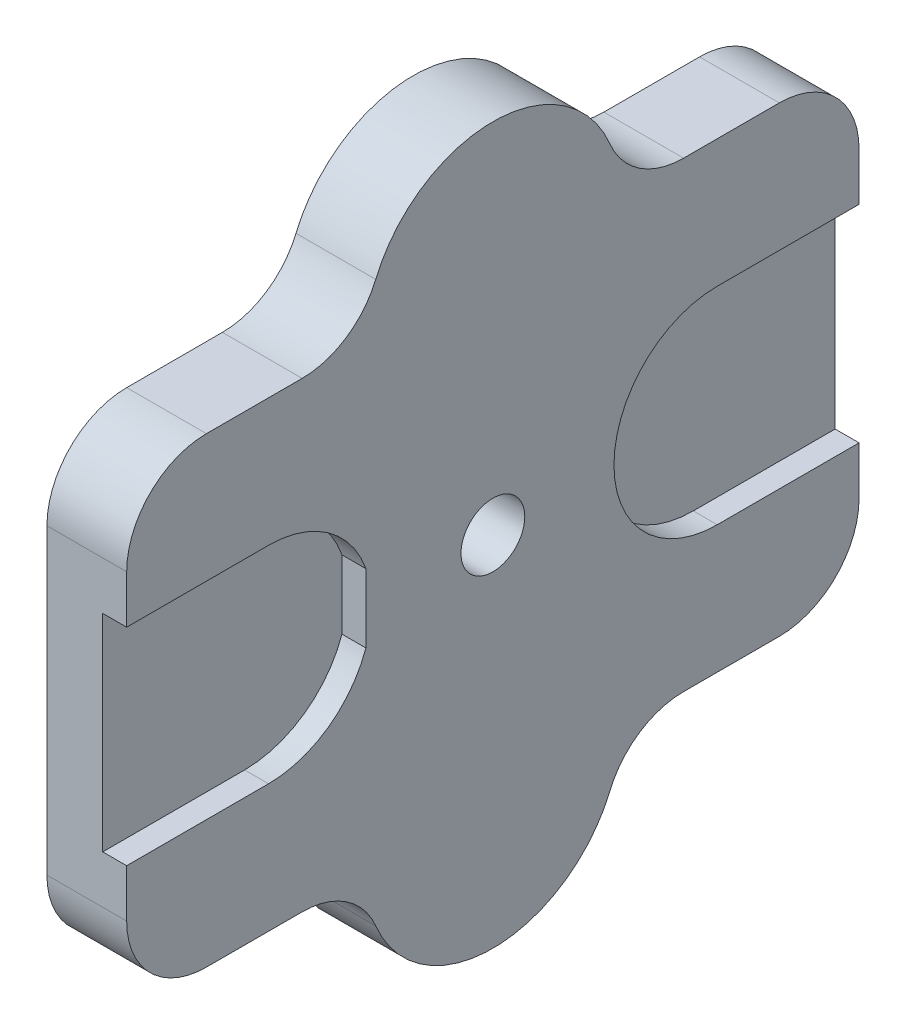
ISO-10303-21;
HEADER;
FILE_DESCRIPTION(('STEP AP214'),'2;1');
FILE_NAME('part.step','',(''),(''),'','','');
FILE_SCHEMA(('AUTOMOTIVE_DESIGN { 1 0 10303 214 1 1 1 1 }'));
ENDSEC;
DATA;
#1=APPLICATION_CONTEXT('core data for automotive mechanical design processes');
#2=APPLICATION_PROTOCOL_DEFINITION('international standard','automotive_design',2000,#1);
#3=PRODUCT_CONTEXT('',#1,'mechanical');
#4=PRODUCT('Part','Part','',(#3));
#5=PRODUCT_RELATED_PRODUCT_CATEGORY('part','',(#4));
#6=PRODUCT_DEFINITION_FORMATION('','',#4);
#7=PRODUCT_DEFINITION_CONTEXT('part definition',#1,'design');
#8=PRODUCT_DEFINITION('design','',#6,#7);
#9=PRODUCT_DEFINITION_SHAPE('','',#8);
#10=(LENGTH_UNIT() NAMED_UNIT(*) SI_UNIT(.MILLI.,.METRE.));
#11=(NAMED_UNIT(*) PLANE_ANGLE_UNIT() SI_UNIT($,.RADIAN.));
#12=(NAMED_UNIT(*) SI_UNIT($,.STERADIAN.) SOLID_ANGLE_UNIT());
#13=UNCERTAINTY_MEASURE_WITH_UNIT(LENGTH_MEASURE(1.E-05),#10,'distance_accuracy_value','');
#14=(GEOMETRIC_REPRESENTATION_CONTEXT(3) GLOBAL_UNCERTAINTY_ASSIGNED_CONTEXT((#13)) GLOBAL_UNIT_ASSIGNED_CONTEXT((#10,
#11,#12)) REPRESENTATION_CONTEXT('',''));
#15=CARTESIAN_POINT('',(0.,0.,0.));
#16=DIRECTION('',(0.,0.,1.));
#17=DIRECTION('',(1.,0.,0.));
#18=AXIS2_PLACEMENT_3D('',#15,#16,#17);
#19=CARTESIAN_POINT('',(10.,-28.9686177509747,3.13232637331732));
#20=DIRECTION('',(1.,0.,0.));
#21=DIRECTION('',(0.,0.,-1.));
#22=AXIS2_PLACEMENT_3D('',#19,#20,#21);
#23=PLANE('',#22);
#24=CARTESIAN_POINT('',(10.,0.,3.13232637331727));
#25=DIRECTION('',(-1.,0.,0.));
#26=DIRECTION('',(0.,0.,1.));
#27=AXIS2_PLACEMENT_3D('',#24,#25,#26);
#28=CIRCLE('',#27,4.);
#29=CARTESIAN_POINT('',(10.,0.,-0.867673626682733));
#30=VERTEX_POINT('',#29);
#31=EDGE_CURVE('E250',#30,#30,#28,.T.);
#32=ORIENTED_EDGE('',*,*,#31,.T.);
#33=EDGE_LOOP('',(#32));
#34=FACE_BOUND('',#33,.T.);
#35=DIRECTION('',(0.,-1.,0.));
#36=VECTOR('',#35,1.);
#37=CARTESIAN_POINT('',(10.,18.9686177509747,-42.7893341747207));
#38=LINE('',#37,#36);
#39=CARTESIAN_POINT('',(10.,-12.95,-42.7893341747207));
#40=VERTEX_POINT('',#39);
#41=CARTESIAN_POINT('',(10.,-18.9686177509747,-42.7893341747207));
#42=VERTEX_POINT('',#41);
#43=EDGE_CURVE('E265',#40,#42,#38,.T.);
#44=ORIENTED_EDGE('',*,*,#43,.F.);
#45=DIRECTION('',(0.,0.,1.));
#46=VECTOR('',#45,1.);
#47=CARTESIAN_POINT('',(10.,-12.95,-42.7893341747207));
#48=LINE('',#47,#46);
#49=CARTESIAN_POINT('',(10.,-12.95,-25.0030511371958));
#50=VERTEX_POINT('',#49);
#51=EDGE_CURVE('E240',#40,#50,#48,.T.);
#52=ORIENTED_EDGE('',*,*,#51,.T.);
#53=CARTESIAN_POINT('',(10.,0.,-25.0030511371959));
#54=DIRECTION('',(-1.,0.,0.));
#55=DIRECTION('',(0.,0.,1.));
#56=AXIS2_PLACEMENT_3D('',#53,#54,#55);
#57=CIRCLE('',#56,12.95);
#58=CARTESIAN_POINT('',(10.,12.95,-25.0030511371958));
#59=VERTEX_POINT('',#58);
#60=EDGE_CURVE('E719',#50,#59,#57,.T.);
#61=ORIENTED_EDGE('',*,*,#60,.T.);
#62=DIRECTION('',(0.,0.,-1.));
#63=VECTOR('',#62,1.);
#64=CARTESIAN_POINT('',(10.,12.95,-25.0030511371958));
#65=LINE('',#64,#63);
#66=CARTESIAN_POINT('',(10.,12.95,-42.7893341747207));
#67=VERTEX_POINT('',#66);
#68=EDGE_CURVE('E718',#59,#67,#65,.T.);
#69=ORIENTED_EDGE('',*,*,#68,.T.);
#70=CARTESIAN_POINT('',(10.,18.9686177509747,-42.7893341747207));
#71=VERTEX_POINT('',#70);
#72=EDGE_CURVE('E244',#71,#67,#38,.T.);
#73=ORIENTED_EDGE('',*,*,#72,.F.);
#74=CARTESIAN_POINT('',(10.,18.9686177509747,-32.7893341747207));
#75=DIRECTION('',(-1.,0.,0.));
#76=DIRECTION('',(0.,0.,-1.));
#77=AXIS2_PLACEMENT_3D('',#74,#75,#76);
#78=CIRCLE('',#77,10.);
#79=CARTESIAN_POINT('',(10.,28.9686177509747,-32.7893341747207));
#80=VERTEX_POINT('',#79);
#81=EDGE_CURVE('E262',#80,#71,#78,.T.);
#82=ORIENTED_EDGE('',*,*,#81,.F.);
#83=DIRECTION('',(0.,0.,-1.));
#84=VECTOR('',#83,1.);
#85=CARTESIAN_POINT('',(10.,28.9686177509747,-32.7893341747207));
#86=LINE('',#85,#84);
#87=CARTESIAN_POINT('',(10.,28.9686177509747,-20.7827836111196));
#88=VERTEX_POINT('',#87);
#89=EDGE_CURVE('E270',#88,#80,#86,.T.);
#90=ORIENTED_EDGE('',*,*,#89,.F.);
#91=CARTESIAN_POINT('',(10.,38.9686177509747,-20.7827836111196));
#92=DIRECTION('',(1.,0.,0.));
#93=DIRECTION('',(0.,0.,-1.));
#94=AXIS2_PLACEMENT_3D('',#91,#92,#93);
#95=CIRCLE('',#94,9.99999999999999);
#96=CARTESIAN_POINT('',(10.,35.1108402056403,-11.5568661819034));
#97=VERTEX_POINT('',#96);
#98=EDGE_CURVE('E269',#97,#88,#95,.T.);
#99=ORIENTED_EDGE('',*,*,#98,.F.);
#100=CARTESIAN_POINT('',(10.,28.9686177509747,3.13232637331732));
#101=DIRECTION('',(1.,0.,0.));
#102=DIRECTION('',(0.,0.,1.));
#103=AXIS2_PLACEMENT_3D('',#100,#101,#102);
#104=CIRCLE('',#103,15.921660548038);
#105=CARTESIAN_POINT('',(10.,35.1108402056403,17.821518928538));
#106=VERTEX_POINT('',#105);
#107=EDGE_CURVE('E70',#97,#106,#104,.T.);
#108=ORIENTED_EDGE('',*,*,#107,.T.);
#109=CARTESIAN_POINT('',(10.,38.9686177509747,27.0474363577541));
#110=DIRECTION('',(-1.,0.,0.));
#111=DIRECTION('',(0.,0.,1.));
#112=AXIS2_PLACEMENT_3D('',#109,#110,#111);
#113=CIRCLE('',#112,9.99999999999999);
#114=CARTESIAN_POINT('',(10.,28.9686177509747,27.0474363577541));
#115=VERTEX_POINT('',#114);
#116=EDGE_CURVE('E355',#106,#115,#113,.T.);
#117=ORIENTED_EDGE('',*,*,#116,.T.);
#118=DIRECTION('',(0.,0.,1.));
#119=VECTOR('',#118,1.);
#120=CARTESIAN_POINT('',(10.,28.9686177509747,39.0539869213552));
#121=LINE('',#120,#119);
#122=CARTESIAN_POINT('',(10.,28.9686177509747,39.0539869213552));
#123=VERTEX_POINT('',#122);
#124=EDGE_CURVE('E358',#115,#123,#121,.T.);
#125=ORIENTED_EDGE('',*,*,#124,.T.);
#126=CARTESIAN_POINT('',(10.,18.9686177509747,39.0539869213552));
#127=DIRECTION('',(1.,0.,0.));
#128=DIRECTION('',(0.,0.,1.));
#129=AXIS2_PLACEMENT_3D('',#126,#127,#128);
#130=CIRCLE('',#129,10.);
#131=CARTESIAN_POINT('',(10.,18.9686177509747,49.0539869213552));
#132=VERTEX_POINT('',#131);
#133=EDGE_CURVE('E357',#123,#132,#130,.T.);
#134=ORIENTED_EDGE('',*,*,#133,.T.);
#135=DIRECTION('',(0.,-1.,0.));
#136=VECTOR('',#135,1.);
#137=CARTESIAN_POINT('',(10.,18.9686177509747,49.0539869213552));
#138=LINE('',#137,#136);
#139=CARTESIAN_POINT('',(10.,12.95,49.0539869213552));
#140=VERTEX_POINT('',#139);
#141=EDGE_CURVE('E363',#132,#140,#138,.T.);
#142=ORIENTED_EDGE('',*,*,#141,.T.);
#143=DIRECTION('',(0.,0.,1.));
#144=VECTOR('',#143,1.);
#145=CARTESIAN_POINT('',(10.,12.95,31.2677038838304));
#146=LINE('',#145,#144);
#147=CARTESIAN_POINT('',(10.,12.95,31.2677038838304));
#148=VERTEX_POINT('',#147);
#149=EDGE_CURVE('E323',#148,#140,#146,.T.);
#150=ORIENTED_EDGE('',*,*,#149,.F.);
#151=CARTESIAN_POINT('',(10.,0.,31.2677038838304));
#152=DIRECTION('',(1.,0.,0.));
#153=DIRECTION('',(0.,0.,-1.));
#154=AXIS2_PLACEMENT_3D('',#151,#152,#153);
#155=CIRCLE('',#154,12.95);
#156=CARTESIAN_POINT('',(10.,4.30437195889774,19.0539869213552));
#157=VERTEX_POINT('',#156);
#158=EDGE_CURVE('E333',#157,#148,#155,.T.);
#159=ORIENTED_EDGE('',*,*,#158,.F.);
#160=DIRECTION('',(0.,1.,0.));
#161=VECTOR('',#160,1.);
#162=CARTESIAN_POINT('',(10.,-28.9686177509747,19.0539869213552));
#163=LINE('',#162,#161);
#164=CARTESIAN_POINT('',(10.,-4.30437195889774,19.0539869213552));
#165=VERTEX_POINT('',#164);
#166=EDGE_CURVE('E272',#165,#157,#163,.T.);
#167=ORIENTED_EDGE('',*,*,#166,.F.);
#168=CARTESIAN_POINT('',(10.,-12.95,31.2677038838304));
#169=VERTEX_POINT('',#168);
#170=EDGE_CURVE('E338',#169,#165,#155,.T.);
#171=ORIENTED_EDGE('',*,*,#170,.F.);
#172=DIRECTION('',(0.,0.,-1.));
#173=VECTOR('',#172,1.);
#174=CARTESIAN_POINT('',(10.,-12.95,49.0539869213552));
#175=LINE('',#174,#173);
#176=CARTESIAN_POINT('',(10.,-12.95,49.0539869213552));
#177=VERTEX_POINT('',#176);
#178=EDGE_CURVE('E318',#177,#169,#175,.T.);
#179=ORIENTED_EDGE('',*,*,#178,.F.);
#180=CARTESIAN_POINT('',(10.,-18.9686177509747,49.0539869213552));
#181=VERTEX_POINT('',#180);
#182=EDGE_CURVE('E356',#177,#181,#138,.T.);
#183=ORIENTED_EDGE('',*,*,#182,.T.);
#184=CARTESIAN_POINT('',(10.,-18.9686177509747,39.0539869213552));
#185=DIRECTION('',(1.,0.,0.));
#186=DIRECTION('',(0.,0.,-1.));
#187=AXIS2_PLACEMENT_3D('',#184,#185,#186);
#188=CIRCLE('',#187,10.);
#189=CARTESIAN_POINT('',(10.,-28.9686177509747,39.0539869213552));
#190=VERTEX_POINT('',#189);
#191=EDGE_CURVE('E365',#181,#190,#188,.T.);
#192=ORIENTED_EDGE('',*,*,#191,.T.);
#193=DIRECTION('',(0.,0.,-1.));
#194=VECTOR('',#193,1.);
#195=CARTESIAN_POINT('',(10.,-28.9686177509747,39.0539869213552));
#196=LINE('',#195,#194);
#197=CARTESIAN_POINT('',(10.,-28.9686177509747,27.0474363577541));
#198=VERTEX_POINT('',#197);
#199=EDGE_CURVE('E368',#190,#198,#196,.T.);
#200=ORIENTED_EDGE('',*,*,#199,.T.);
#201=CARTESIAN_POINT('',(10.,-38.9686177509747,27.0474363577541));
#202=DIRECTION('',(-1.,0.,0.));
#203=DIRECTION('',(0.,0.,-1.));
#204=AXIS2_PLACEMENT_3D('',#201,#202,#203);
#205=CIRCLE('',#204,9.99999999999999);
#206=CARTESIAN_POINT('',(10.,-35.1108402056403,17.821518928538));
#207=VERTEX_POINT('',#206);
#208=EDGE_CURVE('E366',#198,#207,#205,.T.);
#209=ORIENTED_EDGE('',*,*,#208,.T.);
#210=CARTESIAN_POINT('',(10.,-28.9686177509747,3.13232637331732));
#211=DIRECTION('',(1.,0.,0.));
#212=DIRECTION('',(0.,0.,-1.));
#213=AXIS2_PLACEMENT_3D('',#210,#211,#212);
#214=CIRCLE('',#213,15.921660548038);
#215=CARTESIAN_POINT('',(10.,-35.1108402056403,-11.5568661819034));
#216=VERTEX_POINT('',#215);
#217=EDGE_CURVE('E349',#207,#216,#214,.T.);
#218=ORIENTED_EDGE('',*,*,#217,.T.);
#219=CARTESIAN_POINT('',(10.,-38.9686177509747,-20.7827836111196));
#220=DIRECTION('',(1.,0.,0.));
#221=DIRECTION('',(0.,0.,1.));
#222=AXIS2_PLACEMENT_3D('',#219,#220,#221);
#223=CIRCLE('',#222,9.99999999999999);
#224=CARTESIAN_POINT('',(10.,-28.9686177509747,-20.7827836111196));
#225=VERTEX_POINT('',#224);
#226=EDGE_CURVE('E252',#225,#216,#223,.T.);
#227=ORIENTED_EDGE('',*,*,#226,.F.);
#228=DIRECTION('',(0.,0.,1.));
#229=VECTOR('',#228,1.);
#230=CARTESIAN_POINT('',(10.,-28.9686177509747,-32.7893341747207));
#231=LINE('',#230,#229);
#232=CARTESIAN_POINT('',(10.,-28.9686177509747,-32.7893341747207));
#233=VERTEX_POINT('',#232);
#234=EDGE_CURVE('E254',#233,#225,#231,.T.);
#235=ORIENTED_EDGE('',*,*,#234,.F.);
#236=CARTESIAN_POINT('',(10.,-18.9686177509747,-32.7893341747207));
#237=DIRECTION('',(-1.,0.,0.));
#238=DIRECTION('',(0.,0.,1.));
#239=AXIS2_PLACEMENT_3D('',#236,#237,#238);
#240=CIRCLE('',#239,10.);
#241=EDGE_CURVE('E259',#42,#233,#240,.T.);
#242=ORIENTED_EDGE('',*,*,#241,.F.);
#243=EDGE_LOOP('',(#44,#52,#61,#69,#73,#82,#90,#99,#108,#117,#125,#134,#142,#150,#159,#167,#171,
#179,#183,#192,#200,#209,#218,#227,#235,#242));
#244=FACE_BOUND('',#243,.T.);
#245=ADVANCED_FACE('F44',(#34,#244),#23,.T.);
#246=CARTESIAN_POINT('',(10.,18.9686177509747,-42.7893341747207));
#247=DIRECTION('',(0.,0.,-1.));
#248=DIRECTION('',(0.,1.,0.));
#249=AXIS2_PLACEMENT_3D('',#246,#247,#248);
#250=PLANE('',#249);
#251=DIRECTION('',(0.,-1.,0.));
#252=VECTOR('',#251,1.);
#253=CARTESIAN_POINT('',(7.,-12.95,-42.7893341747207));
#254=LINE('',#253,#252);
#255=CARTESIAN_POINT('',(7.,12.95,-42.7893341747207));
#256=VERTEX_POINT('',#255);
#257=CARTESIAN_POINT('',(7.,-12.95,-42.7893341747207));
#258=VERTEX_POINT('',#257);
#259=EDGE_CURVE('E233',#256,#258,#254,.T.);
#260=ORIENTED_EDGE('',*,*,#259,.T.);
#261=DIRECTION('',(1.,0.,0.));
#262=VECTOR('',#261,1.);
#263=CARTESIAN_POINT('',(7.,-12.95,-42.7893341747207));
#264=LINE('',#263,#262);
#265=EDGE_CURVE('E63',#258,#40,#264,.T.);
#266=ORIENTED_EDGE('',*,*,#265,.T.);
#267=ORIENTED_EDGE('',*,*,#43,.T.);
#268=DIRECTION('',(-1.,0.,0.));
#269=VECTOR('',#268,1.);
#270=CARTESIAN_POINT('',(10.,-18.9686177509747,-42.7893341747207));
#271=LINE('',#270,#269);
#272=CARTESIAN_POINT('',(0.,-18.9686177509747,-42.7893341747207));
#273=VERTEX_POINT('',#272);
#274=EDGE_CURVE('E305',#42,#273,#271,.T.);
#275=ORIENTED_EDGE('',*,*,#274,.T.);
#276=DIRECTION('',(0.,-1.,0.));
#277=VECTOR('',#276,1.);
#278=CARTESIAN_POINT('',(0.,18.9686177509747,-42.7893341747207));
#279=LINE('',#278,#277);
#280=CARTESIAN_POINT('',(0.,18.9686177509747,-42.7893341747207));
#281=VERTEX_POINT('',#280);
#282=EDGE_CURVE('E288',#281,#273,#279,.T.);
#283=ORIENTED_EDGE('',*,*,#282,.F.);
#284=DIRECTION('',(-1.,0.,0.));
#285=VECTOR('',#284,1.);
#286=CARTESIAN_POINT('',(10.,18.9686177509747,-42.7893341747207));
#287=LINE('',#286,#285);
#288=EDGE_CURVE('E304',#71,#281,#287,.T.);
#289=ORIENTED_EDGE('',*,*,#288,.F.);
#290=ORIENTED_EDGE('',*,*,#72,.T.);
#291=DIRECTION('',(1.,0.,0.));
#292=VECTOR('',#291,1.);
#293=CARTESIAN_POINT('',(7.,12.95,-42.7893341747207));
#294=LINE('',#293,#292);
#295=EDGE_CURVE('E223',#256,#67,#294,.T.);
#296=ORIENTED_EDGE('',*,*,#295,.F.);
#297=EDGE_LOOP('',(#260,#266,#267,#275,#283,#289,#290,#296));
#298=FACE_BOUND('',#297,.T.);
#299=ADVANCED_FACE('F238',(#298),#250,.T.);
#300=CARTESIAN_POINT('',(10.,-28.9686177509747,3.13232637331732));
#301=DIRECTION('',(-1.,0.,0.));
#302=DIRECTION('',(0.,0.,1.));
#303=AXIS2_PLACEMENT_3D('',#300,#301,#302);
#304=CYLINDRICAL_SURFACE('',#303,15.921660548038);
#305=DIRECTION('',(-1.,0.,0.));
#306=VECTOR('',#305,1.);
#307=CARTESIAN_POINT('',(10.,-35.1108402056403,-11.5568661819034));
#308=LINE('',#307,#306);
#309=CARTESIAN_POINT('',(0.,-35.1108402056403,-11.5568661819034));
#310=VERTEX_POINT('',#309);
#311=EDGE_CURVE('E309',#216,#310,#308,.T.);
#312=ORIENTED_EDGE('',*,*,#311,.F.);
#313=ORIENTED_EDGE('',*,*,#217,.F.);
#314=DIRECTION('',(-1.,0.,0.));
#315=VECTOR('',#314,1.);
#316=CARTESIAN_POINT('',(10.,-35.1108402056403,17.821518928538));
#317=LINE('',#316,#315);
#318=CARTESIAN_POINT('',(0.,-35.1108402056403,17.821518928538));
#319=VERTEX_POINT('',#318);
#320=EDGE_CURVE('E367',#207,#319,#317,.T.);
#321=ORIENTED_EDGE('',*,*,#320,.T.);
#322=CARTESIAN_POINT('',(0.,-28.9686177509747,3.13232637331732));
#323=DIRECTION('',(1.,0.,0.));
#324=DIRECTION('',(0.,0.,-1.));
#325=AXIS2_PLACEMENT_3D('',#322,#323,#324);
#326=CIRCLE('',#325,15.921660548038);
#327=EDGE_CURVE('E344',#319,#310,#326,.T.);
#328=ORIENTED_EDGE('',*,*,#327,.T.);
#329=EDGE_LOOP('',(#312,#313,#321,#328));
#330=FACE_BOUND('',#329,.T.);
#331=ADVANCED_FACE('F50',(#330),#304,.T.);
#332=CARTESIAN_POINT('',(7.,0.,31.2677038838304));
#333=DIRECTION('',(1.,0.,0.));
#334=DIRECTION('',(0.,0.,-1.));
#335=AXIS2_PLACEMENT_3D('',#332,#333,#334);
#336=CYLINDRICAL_SURFACE('',#335,12.95);
#337=ORIENTED_EDGE('',*,*,#170,.T.);
#338=DIRECTION('',(1.,0.,0.));
#339=VECTOR('',#338,1.);
#340=CARTESIAN_POINT('',(7.,-4.30437195889774,19.0539869213552));
#341=LINE('',#340,#339);
#342=CARTESIAN_POINT('',(7.,-4.30437195889774,19.0539869213552));
#343=VERTEX_POINT('',#342);
#344=EDGE_CURVE('E312',#165,#343,#341,.F.);
#345=ORIENTED_EDGE('',*,*,#344,.T.);
#346=CARTESIAN_POINT('',(7.,0.,31.2677038838304));
#347=DIRECTION('',(1.,0.,0.));
#348=DIRECTION('',(0.,0.,-1.));
#349=AXIS2_PLACEMENT_3D('',#346,#347,#348);
#350=CIRCLE('',#349,12.95);
#351=CARTESIAN_POINT('',(7.,-12.95,31.2677038838304));
#352=VERTEX_POINT('',#351);
#353=EDGE_CURVE('E330',#352,#343,#350,.T.);
#354=ORIENTED_EDGE('',*,*,#353,.F.);
#355=DIRECTION('',(1.,0.,0.));
#356=VECTOR('',#355,1.);
#357=CARTESIAN_POINT('',(7.,-12.95,31.2677038838304));
#358=LINE('',#357,#356);
#359=EDGE_CURVE('E347',#352,#169,#358,.T.);
#360=ORIENTED_EDGE('',*,*,#359,.T.);
#361=EDGE_LOOP('',(#337,#345,#354,#360));
#362=FACE_BOUND('',#361,.T.);
#363=ADVANCED_FACE('F439',(#362),#336,.F.);
#364=CARTESIAN_POINT('',(10.,28.9686177509747,3.13232637331732));
#365=DIRECTION('',(-1.,0.,0.));
#366=DIRECTION('',(0.,0.,1.));
#367=AXIS2_PLACEMENT_3D('',#364,#365,#366);
#368=CYLINDRICAL_SURFACE('',#367,15.921660548038);
#369=ORIENTED_EDGE('',*,*,#107,.F.);
#370=DIRECTION('',(-1.,0.,0.));
#371=VECTOR('',#370,1.);
#372=CARTESIAN_POINT('',(10.,35.1108402056403,-11.5568661819035));
#373=LINE('',#372,#371);
#374=CARTESIAN_POINT('',(0.,35.1108402056403,-11.5568661819035));
#375=VERTEX_POINT('',#374);
#376=EDGE_CURVE('E277',#97,#375,#373,.T.);
#377=ORIENTED_EDGE('',*,*,#376,.T.);
#378=CARTESIAN_POINT('',(0.,28.9686177509747,3.13232637331732));
#379=DIRECTION('',(1.,0.,0.));
#380=DIRECTION('',(0.,0.,1.));
#381=AXIS2_PLACEMENT_3D('',#378,#379,#380);
#382=CIRCLE('',#381,15.921660548038);
#383=CARTESIAN_POINT('',(0.,35.1108402056403,17.821518928538));
#384=VERTEX_POINT('',#383);
#385=EDGE_CURVE('E375',#375,#384,#382,.T.);
#386=ORIENTED_EDGE('',*,*,#385,.T.);
#387=DIRECTION('',(-1.,0.,0.));
#388=VECTOR('',#387,1.);
#389=CARTESIAN_POINT('',(10.,35.1108402056403,17.821518928538));
#390=LINE('',#389,#388);
#391=EDGE_CURVE('E53',#106,#384,#390,.T.);
#392=ORIENTED_EDGE('',*,*,#391,.F.);
#393=EDGE_LOOP('',(#369,#377,#386,#392));
#394=FACE_BOUND('',#393,.T.);
#395=ADVANCED_FACE('F437',(#394),#368,.T.);
#396=CARTESIAN_POINT('',(10.,38.9686177509747,27.0474363577541));
#397=DIRECTION('',(-1.,0.,0.));
#398=DIRECTION('',(0.,0.,1.));
#399=AXIS2_PLACEMENT_3D('',#396,#397,#398);
#400=CYLINDRICAL_SURFACE('',#399,9.99999999999999);
#401=CARTESIAN_POINT('',(0.,38.9686177509747,27.0474363577541));
#402=DIRECTION('',(-1.,0.,0.));
#403=DIRECTION('',(0.,0.,1.));
#404=AXIS2_PLACEMENT_3D('',#401,#402,#403);
#405=CIRCLE('',#404,9.99999999999999);
#406=CARTESIAN_POINT('',(0.,28.9686177509747,27.0474363577541));
#407=VERTEX_POINT('',#406);
#408=EDGE_CURVE('E372',#384,#407,#405,.T.);
#409=ORIENTED_EDGE('',*,*,#408,.T.);
#410=DIRECTION('',(-1.,0.,0.));
#411=VECTOR('',#410,1.);
#412=CARTESIAN_POINT('',(10.,28.9686177509747,27.0474363577541));
#413=LINE('',#412,#411);
#414=EDGE_CURVE('E404',#115,#407,#413,.T.);
#415=ORIENTED_EDGE('',*,*,#414,.F.);
#416=ORIENTED_EDGE('',*,*,#116,.F.);
#417=ORIENTED_EDGE('',*,*,#391,.T.);
#418=EDGE_LOOP('',(#409,#415,#416,#417));
#419=FACE_BOUND('',#418,.T.);
#420=ADVANCED_FACE('F413',(#419),#400,.F.);
#421=CARTESIAN_POINT('',(10.,28.9686177509747,39.0539869213552));
#422=DIRECTION('',(0.,-1.,0.));
#423=DIRECTION('',(0.,0.,-1.));
#424=AXIS2_PLACEMENT_3D('',#421,#422,#423);
#425=PLANE('',#424);
#426=DIRECTION('',(0.,0.,1.));
#427=VECTOR('',#426,1.);
#428=CARTESIAN_POINT('',(0.,28.9686177509747,39.0539869213552));
#429=LINE('',#428,#427);
#430=CARTESIAN_POINT('',(0.,28.9686177509747,39.0539869213552));
#431=VERTEX_POINT('',#430);
#432=EDGE_CURVE('E376',#407,#431,#429,.T.);
#433=ORIENTED_EDGE('',*,*,#432,.T.);
#434=DIRECTION('',(-1.,0.,0.));
#435=VECTOR('',#434,1.);
#436=CARTESIAN_POINT('',(10.,28.9686177509747,39.0539869213552));
#437=LINE('',#436,#435);
#438=EDGE_CURVE('E402',#123,#431,#437,.T.);
#439=ORIENTED_EDGE('',*,*,#438,.F.);
#440=ORIENTED_EDGE('',*,*,#124,.F.);
#441=ORIENTED_EDGE('',*,*,#414,.T.);
#442=EDGE_LOOP('',(#433,#439,#440,#441));
#443=FACE_BOUND('',#442,.T.);
#444=ADVANCED_FACE('F423',(#443),#425,.F.);
#445=CARTESIAN_POINT('',(10.,18.9686177509747,39.0539869213552));
#446=DIRECTION('',(-1.,0.,0.));
#447=DIRECTION('',(0.,0.,1.));
#448=AXIS2_PLACEMENT_3D('',#445,#446,#447);
#449=CYLINDRICAL_SURFACE('',#448,10.);
#450=CARTESIAN_POINT('',(0.,18.9686177509747,39.0539869213552));
#451=DIRECTION('',(1.,0.,0.));
#452=DIRECTION('',(0.,0.,1.));
#453=AXIS2_PLACEMENT_3D('',#450,#451,#452);
#454=CIRCLE('',#453,10.);
#455=CARTESIAN_POINT('',(0.,18.9686177509747,49.0539869213552));
#456=VERTEX_POINT('',#455);
#457=EDGE_CURVE('E378',#431,#456,#454,.T.);
#458=ORIENTED_EDGE('',*,*,#457,.T.);
#459=DIRECTION('',(-1.,0.,0.));
#460=VECTOR('',#459,1.);
#461=CARTESIAN_POINT('',(10.,18.9686177509747,49.0539869213552));
#462=LINE('',#461,#460);
#463=EDGE_CURVE('E397',#132,#456,#462,.T.);
#464=ORIENTED_EDGE('',*,*,#463,.F.);
#465=ORIENTED_EDGE('',*,*,#133,.F.);
#466=ORIENTED_EDGE('',*,*,#438,.T.);
#467=EDGE_LOOP('',(#458,#464,#465,#466));
#468=FACE_BOUND('',#467,.T.);
#469=ADVANCED_FACE('F422',(#468),#449,.T.);
#470=CARTESIAN_POINT('',(10.,18.9686177509747,49.0539869213552));
#471=DIRECTION('',(0.,0.,-1.));
#472=DIRECTION('',(0.,1.,0.));
#473=AXIS2_PLACEMENT_3D('',#470,#471,#472);
#474=PLANE('',#473);
#475=DIRECTION('',(0.,-1.,0.));
#476=VECTOR('',#475,1.);
#477=CARTESIAN_POINT('',(7.,-12.95,49.0539869213552));
#478=LINE('',#477,#476);
#479=CARTESIAN_POINT('',(7.,12.95,49.0539869213552));
#480=VERTEX_POINT('',#479);
#481=CARTESIAN_POINT('',(7.,-12.95,49.0539869213552));
#482=VERTEX_POINT('',#481);
#483=EDGE_CURVE('E317',#480,#482,#478,.T.);
#484=ORIENTED_EDGE('',*,*,#483,.F.);
#485=DIRECTION('',(1.,0.,0.));
#486=VECTOR('',#485,1.);
#487=CARTESIAN_POINT('',(7.,12.95,49.0539869213552));
#488=LINE('',#487,#486);
#489=EDGE_CURVE('E340',#480,#140,#488,.T.);
#490=ORIENTED_EDGE('',*,*,#489,.T.);
#491=ORIENTED_EDGE('',*,*,#141,.F.);
#492=ORIENTED_EDGE('',*,*,#463,.T.);
#493=DIRECTION('',(0.,-1.,0.));
#494=VECTOR('',#493,1.);
#495=CARTESIAN_POINT('',(0.,18.9686177509747,49.0539869213552));
#496=LINE('',#495,#494);
#497=CARTESIAN_POINT('',(0.,-18.9686177509747,49.0539869213552));
#498=VERTEX_POINT('',#497);
#499=EDGE_CURVE('E379',#456,#498,#496,.T.);
#500=ORIENTED_EDGE('',*,*,#499,.T.);
#501=DIRECTION('',(-1.,0.,0.));
#502=VECTOR('',#501,1.);
#503=CARTESIAN_POINT('',(10.,-18.9686177509747,49.0539869213552));
#504=LINE('',#503,#502);
#505=EDGE_CURVE('E391',#181,#498,#504,.T.);
#506=ORIENTED_EDGE('',*,*,#505,.F.);
#507=ORIENTED_EDGE('',*,*,#182,.F.);
#508=DIRECTION('',(1.,0.,0.));
#509=VECTOR('',#508,1.);
#510=CARTESIAN_POINT('',(7.,-12.95,49.0539869213552));
#511=LINE('',#510,#509);
#512=EDGE_CURVE('E335',#482,#177,#511,.T.);
#513=ORIENTED_EDGE('',*,*,#512,.F.);
#514=EDGE_LOOP('',(#484,#490,#491,#492,#500,#506,#507,#513));
#515=FACE_BOUND('',#514,.T.);
#516=ADVANCED_FACE('F475',(#515),#474,.F.);
#517=CARTESIAN_POINT('',(10.,-18.9686177509747,39.0539869213552));
#518=DIRECTION('',(-1.,0.,0.));
#519=DIRECTION('',(0.,0.,1.));
#520=AXIS2_PLACEMENT_3D('',#517,#518,#519);
#521=CYLINDRICAL_SURFACE('',#520,10.);
#522=CARTESIAN_POINT('',(0.,-18.9686177509747,39.0539869213552));
#523=DIRECTION('',(1.,0.,0.));
#524=DIRECTION('',(0.,0.,-1.));
#525=AXIS2_PLACEMENT_3D('',#522,#523,#524);
#526=CIRCLE('',#525,10.);
#527=CARTESIAN_POINT('',(0.,-28.9686177509747,39.0539869213552));
#528=VERTEX_POINT('',#527);
#529=EDGE_CURVE('E385',#498,#528,#526,.T.);
#530=ORIENTED_EDGE('',*,*,#529,.T.);
#531=DIRECTION('',(-1.,0.,0.));
#532=VECTOR('',#531,1.);
#533=CARTESIAN_POINT('',(10.,-28.9686177509747,39.0539869213552));
#534=LINE('',#533,#532);
#535=EDGE_CURVE('E394',#190,#528,#534,.T.);
#536=ORIENTED_EDGE('',*,*,#535,.F.);
#537=ORIENTED_EDGE('',*,*,#191,.F.);
#538=ORIENTED_EDGE('',*,*,#505,.T.);
#539=EDGE_LOOP('',(#530,#536,#537,#538));
#540=FACE_BOUND('',#539,.T.);
#541=ADVANCED_FACE('F466',(#540),#521,.T.);
#542=CARTESIAN_POINT('',(10.,-28.9686177509747,39.0539869213552));
#543=DIRECTION('',(0.,1.,0.));
#544=DIRECTION('',(0.,0.,1.));
#545=AXIS2_PLACEMENT_3D('',#542,#543,#544);
#546=PLANE('',#545);
#547=DIRECTION('',(0.,0.,-1.));
#548=VECTOR('',#547,1.);
#549=CARTESIAN_POINT('',(0.,-28.9686177509747,39.0539869213552));
#550=LINE('',#549,#548);
#551=CARTESIAN_POINT('',(0.,-28.9686177509747,27.0474363577541));
#552=VERTEX_POINT('',#551);
#553=EDGE_CURVE('E383',#528,#552,#550,.T.);
#554=ORIENTED_EDGE('',*,*,#553,.T.);
#555=DIRECTION('',(-1.,0.,0.));
#556=VECTOR('',#555,1.);
#557=CARTESIAN_POINT('',(10.,-28.9686177509747,27.0474363577541));
#558=LINE('',#557,#556);
#559=EDGE_CURVE('E386',#198,#552,#558,.T.);
#560=ORIENTED_EDGE('',*,*,#559,.F.);
#561=ORIENTED_EDGE('',*,*,#199,.F.);
#562=ORIENTED_EDGE('',*,*,#535,.T.);
#563=EDGE_LOOP('',(#554,#560,#561,#562));
#564=FACE_BOUND('',#563,.T.);
#565=ADVANCED_FACE('F468',(#564),#546,.F.);
#566=CARTESIAN_POINT('',(10.,-38.9686177509747,27.0474363577541));
#567=DIRECTION('',(-1.,0.,0.));
#568=DIRECTION('',(0.,0.,1.));
#569=AXIS2_PLACEMENT_3D('',#566,#567,#568);
#570=CYLINDRICAL_SURFACE('',#569,9.99999999999999);
#571=CARTESIAN_POINT('',(0.,-38.9686177509747,27.0474363577541));
#572=DIRECTION('',(-1.,0.,0.));
#573=DIRECTION('',(0.,0.,-1.));
#574=AXIS2_PLACEMENT_3D('',#571,#572,#573);
#575=CIRCLE('',#574,9.99999999999999);
#576=EDGE_CURVE('E354',#552,#319,#575,.T.);
#577=ORIENTED_EDGE('',*,*,#576,.T.);
#578=ORIENTED_EDGE('',*,*,#320,.F.);
#579=ORIENTED_EDGE('',*,*,#208,.F.);
#580=ORIENTED_EDGE('',*,*,#559,.T.);
#581=EDGE_LOOP('',(#577,#578,#579,#580));
#582=FACE_BOUND('',#581,.T.);
#583=ADVANCED_FACE('F464',(#582),#570,.F.);
#584=CARTESIAN_POINT('',(0.,-28.9686177509747,3.13232637331732));
#585=DIRECTION('',(1.,0.,0.));
#586=DIRECTION('',(0.,0.,-1.));
#587=AXIS2_PLACEMENT_3D('',#584,#585,#586);
#588=PLANE('',#587);
#589=CARTESIAN_POINT('',(0.,0.,3.13232637331727));
#590=DIRECTION('',(1.,0.,0.));
#591=DIRECTION('',(0.,0.,-1.));
#592=AXIS2_PLACEMENT_3D('',#589,#590,#591);
#593=CIRCLE('',#592,4.);
#594=CARTESIAN_POINT('',(0.,0.,-0.867673626682733));
#595=VERTEX_POINT('',#594);
#596=EDGE_CURVE('E47',#595,#595,#593,.F.);
#597=ORIENTED_EDGE('',*,*,#596,.F.);
#598=EDGE_LOOP('',(#597));
#599=FACE_BOUND('',#598,.T.);
#600=ORIENTED_EDGE('',*,*,#327,.F.);
#601=ORIENTED_EDGE('',*,*,#576,.F.);
#602=ORIENTED_EDGE('',*,*,#553,.F.);
#603=ORIENTED_EDGE('',*,*,#529,.F.);
#604=ORIENTED_EDGE('',*,*,#499,.F.);
#605=ORIENTED_EDGE('',*,*,#457,.F.);
#606=ORIENTED_EDGE('',*,*,#432,.F.);
#607=ORIENTED_EDGE('',*,*,#408,.F.);
#608=ORIENTED_EDGE('',*,*,#385,.F.);
#609=CARTESIAN_POINT('',(0.,38.9686177509747,-20.7827836111196));
#610=DIRECTION('',(1.,0.,0.));
#611=DIRECTION('',(0.,0.,-1.));
#612=AXIS2_PLACEMENT_3D('',#609,#610,#611);
#613=CIRCLE('',#612,9.99999999999999);
#614=CARTESIAN_POINT('',(0.,28.9686177509747,-20.7827836111196));
#615=VERTEX_POINT('',#614);
#616=EDGE_CURVE('E258',#375,#615,#613,.T.);
#617=ORIENTED_EDGE('',*,*,#616,.T.);
#618=DIRECTION('',(0.,0.,-1.));
#619=VECTOR('',#618,1.);
#620=CARTESIAN_POINT('',(0.,28.9686177509747,-32.7893341747207));
#621=LINE('',#620,#619);
#622=CARTESIAN_POINT('',(0.,28.9686177509747,-32.7893341747207));
#623=VERTEX_POINT('',#622);
#624=EDGE_CURVE('E295',#615,#623,#621,.T.);
#625=ORIENTED_EDGE('',*,*,#624,.T.);
#626=CARTESIAN_POINT('',(0.,18.9686177509747,-32.7893341747207));
#627=DIRECTION('',(-1.,0.,0.));
#628=DIRECTION('',(0.,0.,-1.));
#629=AXIS2_PLACEMENT_3D('',#626,#627,#628);
#630=CIRCLE('',#629,10.);
#631=EDGE_CURVE('E290',#623,#281,#630,.T.);
#632=ORIENTED_EDGE('',*,*,#631,.T.);
#633=ORIENTED_EDGE('',*,*,#282,.T.);
#634=CARTESIAN_POINT('',(0.,-18.9686177509747,-32.7893341747207));
#635=DIRECTION('',(-1.,0.,0.));
#636=DIRECTION('',(0.,0.,1.));
#637=AXIS2_PLACEMENT_3D('',#634,#635,#636);
#638=CIRCLE('',#637,10.);
#639=CARTESIAN_POINT('',(0.,-28.9686177509747,-32.7893341747207));
#640=VERTEX_POINT('',#639);
#641=EDGE_CURVE('E282',#273,#640,#638,.T.);
#642=ORIENTED_EDGE('',*,*,#641,.T.);
#643=DIRECTION('',(0.,0.,1.));
#644=VECTOR('',#643,1.);
#645=CARTESIAN_POINT('',(0.,-28.9686177509747,-32.7893341747207));
#646=LINE('',#645,#644);
#647=CARTESIAN_POINT('',(0.,-28.9686177509747,-20.7827836111196));
#648=VERTEX_POINT('',#647);
#649=EDGE_CURVE('E278',#640,#648,#646,.T.);
#650=ORIENTED_EDGE('',*,*,#649,.T.);
#651=CARTESIAN_POINT('',(0.,-38.9686177509747,-20.7827836111196));
#652=DIRECTION('',(1.,0.,0.));
#653=DIRECTION('',(0.,0.,1.));
#654=AXIS2_PLACEMENT_3D('',#651,#652,#653);
#655=CIRCLE('',#654,9.99999999999999);
#656=EDGE_CURVE('E280',#648,#310,#655,.T.);
#657=ORIENTED_EDGE('',*,*,#656,.T.);
#658=EDGE_LOOP('',(#600,#601,#602,#603,#604,#605,#606,#607,#608,#617,#625,#632,#633,#642,#650,#657));
#659=FACE_BOUND('',#658,.T.);
#660=ADVANCED_FACE('F418',(#599,#659),#588,.F.);
#661=CARTESIAN_POINT('',(7.,12.95,31.2677038838304));
#662=DIRECTION('',(0.,1.,0.));
#663=DIRECTION('',(0.,0.,1.));
#664=AXIS2_PLACEMENT_3D('',#661,#662,#663);
#665=PLANE('',#664);
#666=ORIENTED_EDGE('',*,*,#149,.T.);
#667=ORIENTED_EDGE('',*,*,#489,.F.);
#668=DIRECTION('',(0.,0.,1.));
#669=VECTOR('',#668,1.);
#670=CARTESIAN_POINT('',(7.,12.95,31.2677038838304));
#671=LINE('',#670,#669);
#672=CARTESIAN_POINT('',(7.,12.95,31.2677038838304));
#673=VERTEX_POINT('',#672);
#674=EDGE_CURVE('E328',#673,#480,#671,.T.);
#675=ORIENTED_EDGE('',*,*,#674,.F.);
#676=DIRECTION('',(1.,0.,0.));
#677=VECTOR('',#676,1.);
#678=CARTESIAN_POINT('',(7.,12.95,31.2677038838304));
#679=LINE('',#678,#677);
#680=EDGE_CURVE('E342',#673,#148,#679,.T.);
#681=ORIENTED_EDGE('',*,*,#680,.T.);
#682=EDGE_LOOP('',(#666,#667,#675,#681));
#683=FACE_BOUND('',#682,.T.);
#684=ADVANCED_FACE('F463',(#683),#665,.F.);
#685=CARTESIAN_POINT('',(7.,4.30437195889774,19.0539869213552));
#686=VERTEX_POINT('',#685);
#687=EDGE_CURVE('E326',#686,#673,#350,.T.);
#688=ORIENTED_EDGE('',*,*,#687,.F.);
#689=DIRECTION('',(1.,0.,0.));
#690=VECTOR('',#689,1.);
#691=CARTESIAN_POINT('',(7.,4.30437195889774,19.0539869213552));
#692=LINE('',#691,#690);
#693=EDGE_CURVE('E311',#686,#157,#692,.T.);
#694=ORIENTED_EDGE('',*,*,#693,.T.);
#695=ORIENTED_EDGE('',*,*,#158,.T.);
#696=ORIENTED_EDGE('',*,*,#680,.F.);
#697=EDGE_LOOP('',(#688,#694,#695,#696));
#698=FACE_BOUND('',#697,.T.);
#699=ADVANCED_FACE('F450',(#698),#336,.F.);
#700=CARTESIAN_POINT('',(7.,-12.95,49.0539869213552));
#701=DIRECTION('',(0.,-1.,0.));
#702=DIRECTION('',(0.,0.,-1.));
#703=AXIS2_PLACEMENT_3D('',#700,#701,#702);
#704=PLANE('',#703);
#705=ORIENTED_EDGE('',*,*,#178,.T.);
#706=ORIENTED_EDGE('',*,*,#359,.F.);
#707=DIRECTION('',(0.,0.,-1.));
#708=VECTOR('',#707,1.);
#709=CARTESIAN_POINT('',(7.,-12.95,49.0539869213552));
#710=LINE('',#709,#708);
#711=EDGE_CURVE('E325',#482,#352,#710,.T.);
#712=ORIENTED_EDGE('',*,*,#711,.F.);
#713=ORIENTED_EDGE('',*,*,#512,.T.);
#714=EDGE_LOOP('',(#705,#706,#712,#713));
#715=FACE_BOUND('',#714,.T.);
#716=ADVANCED_FACE('F459',(#715),#704,.F.);
#717=CARTESIAN_POINT('',(7.,0.,31.2677038838304));
#718=DIRECTION('',(1.,0.,0.));
#719=DIRECTION('',(0.,0.,-1.));
#720=AXIS2_PLACEMENT_3D('',#717,#718,#719);
#721=PLANE('',#720);
#722=DIRECTION('',(0.,-1.,0.));
#723=VECTOR('',#722,1.);
#724=CARTESIAN_POINT('',(7.,0.,19.0539869213552));
#725=LINE('',#724,#723);
#726=EDGE_CURVE('E11',#686,#343,#725,.T.);
#727=ORIENTED_EDGE('',*,*,#726,.F.);
#728=ORIENTED_EDGE('',*,*,#687,.T.);
#729=ORIENTED_EDGE('',*,*,#674,.T.);
#730=ORIENTED_EDGE('',*,*,#483,.T.);
#731=ORIENTED_EDGE('',*,*,#711,.T.);
#732=ORIENTED_EDGE('',*,*,#353,.T.);
#733=EDGE_LOOP('',(#727,#728,#729,#730,#731,#732));
#734=FACE_BOUND('',#733,.T.);
#735=ADVANCED_FACE('F526',(#734),#721,.T.);
#736=CARTESIAN_POINT('',(10.,-28.9686177509747,19.0539869213552));
#737=DIRECTION('',(0.,0.,1.));
#738=DIRECTION('',(1.,0.,0.));
#739=AXIS2_PLACEMENT_3D('',#736,#737,#738);
#740=PLANE('',#739);
#741=ORIENTED_EDGE('',*,*,#344,.F.);
#742=ORIENTED_EDGE('',*,*,#166,.T.);
#743=ORIENTED_EDGE('',*,*,#693,.F.);
#744=ORIENTED_EDGE('',*,*,#726,.T.);
#745=EDGE_LOOP('',(#741,#742,#743,#744));
#746=FACE_BOUND('',#745,.T.);
#747=ADVANCED_FACE('F564',(#746),#740,.T.);
#748=CARTESIAN_POINT('',(10.,-38.9686177509747,-20.7827836111196));
#749=DIRECTION('',(-1.,0.,0.));
#750=DIRECTION('',(0.,0.,1.));
#751=AXIS2_PLACEMENT_3D('',#748,#749,#750);
#752=CYLINDRICAL_SURFACE('',#751,9.99999999999999);
#753=ORIENTED_EDGE('',*,*,#656,.F.);
#754=DIRECTION('',(-1.,0.,0.));
#755=VECTOR('',#754,1.);
#756=CARTESIAN_POINT('',(10.,-28.9686177509747,-20.7827836111196));
#757=LINE('',#756,#755);
#758=EDGE_CURVE('E306',#225,#648,#757,.T.);
#759=ORIENTED_EDGE('',*,*,#758,.F.);
#760=ORIENTED_EDGE('',*,*,#226,.T.);
#761=ORIENTED_EDGE('',*,*,#311,.T.);
#762=EDGE_LOOP('',(#753,#759,#760,#761));
#763=FACE_BOUND('',#762,.T.);
#764=ADVANCED_FACE('F603',(#763),#752,.F.);
#765=CARTESIAN_POINT('',(10.,-28.9686177509747,-32.7893341747207));
#766=DIRECTION('',(0.,-1.,0.));
#767=DIRECTION('',(0.,0.,-1.));
#768=AXIS2_PLACEMENT_3D('',#765,#766,#767);
#769=PLANE('',#768);
#770=ORIENTED_EDGE('',*,*,#649,.F.);
#771=DIRECTION('',(-1.,0.,0.));
#772=VECTOR('',#771,1.);
#773=CARTESIAN_POINT('',(10.,-28.9686177509747,-32.7893341747207));
#774=LINE('',#773,#772);
#775=EDGE_CURVE('E308',#233,#640,#774,.T.);
#776=ORIENTED_EDGE('',*,*,#775,.F.);
#777=ORIENTED_EDGE('',*,*,#234,.T.);
#778=ORIENTED_EDGE('',*,*,#758,.T.);
#779=EDGE_LOOP('',(#770,#776,#777,#778));
#780=FACE_BOUND('',#779,.T.);
#781=ADVANCED_FACE('F615',(#780),#769,.T.);
#782=CARTESIAN_POINT('',(10.,-18.9686177509747,-32.7893341747207));
#783=DIRECTION('',(-1.,0.,0.));
#784=DIRECTION('',(0.,0.,1.));
#785=AXIS2_PLACEMENT_3D('',#782,#783,#784);
#786=CYLINDRICAL_SURFACE('',#785,10.);
#787=ORIENTED_EDGE('',*,*,#641,.F.);
#788=ORIENTED_EDGE('',*,*,#274,.F.);
#789=ORIENTED_EDGE('',*,*,#241,.T.);
#790=ORIENTED_EDGE('',*,*,#775,.T.);
#791=EDGE_LOOP('',(#787,#788,#789,#790));
#792=FACE_BOUND('',#791,.T.);
#793=ADVANCED_FACE('F624',(#792),#786,.T.);
#794=CARTESIAN_POINT('',(10.,18.9686177509747,-32.7893341747207));
#795=DIRECTION('',(-1.,0.,0.));
#796=DIRECTION('',(0.,0.,1.));
#797=AXIS2_PLACEMENT_3D('',#794,#795,#796);
#798=CYLINDRICAL_SURFACE('',#797,10.);
#799=ORIENTED_EDGE('',*,*,#631,.F.);
#800=DIRECTION('',(-1.,0.,0.));
#801=VECTOR('',#800,1.);
#802=CARTESIAN_POINT('',(10.,28.9686177509747,-32.7893341747207));
#803=LINE('',#802,#801);
#804=EDGE_CURVE('E296',#80,#623,#803,.T.);
#805=ORIENTED_EDGE('',*,*,#804,.F.);
#806=ORIENTED_EDGE('',*,*,#81,.T.);
#807=ORIENTED_EDGE('',*,*,#288,.T.);
#808=EDGE_LOOP('',(#799,#805,#806,#807));
#809=FACE_BOUND('',#808,.T.);
#810=ADVANCED_FACE('F635',(#809),#798,.T.);
#811=CARTESIAN_POINT('',(10.,28.9686177509747,-32.7893341747207));
#812=DIRECTION('',(0.,1.,0.));
#813=DIRECTION('',(0.,0.,1.));
#814=AXIS2_PLACEMENT_3D('',#811,#812,#813);
#815=PLANE('',#814);
#816=ORIENTED_EDGE('',*,*,#624,.F.);
#817=DIRECTION('',(-1.,0.,0.));
#818=VECTOR('',#817,1.);
#819=CARTESIAN_POINT('',(10.,28.9686177509747,-20.7827836111196));
#820=LINE('',#819,#818);
#821=EDGE_CURVE('E297',#88,#615,#820,.T.);
#822=ORIENTED_EDGE('',*,*,#821,.F.);
#823=ORIENTED_EDGE('',*,*,#89,.T.);
#824=ORIENTED_EDGE('',*,*,#804,.T.);
#825=EDGE_LOOP('',(#816,#822,#823,#824));
#826=FACE_BOUND('',#825,.T.);
#827=ADVANCED_FACE('F644',(#826),#815,.T.);
#828=CARTESIAN_POINT('',(10.,38.9686177509747,-20.7827836111196));
#829=DIRECTION('',(-1.,0.,0.));
#830=DIRECTION('',(0.,0.,1.));
#831=AXIS2_PLACEMENT_3D('',#828,#829,#830);
#832=CYLINDRICAL_SURFACE('',#831,9.99999999999999);
#833=ORIENTED_EDGE('',*,*,#616,.F.);
#834=ORIENTED_EDGE('',*,*,#376,.F.);
#835=ORIENTED_EDGE('',*,*,#98,.T.);
#836=ORIENTED_EDGE('',*,*,#821,.T.);
#837=EDGE_LOOP('',(#833,#834,#835,#836));
#838=FACE_BOUND('',#837,.T.);
#839=ADVANCED_FACE('F436',(#838),#832,.F.);
#840=CARTESIAN_POINT('',(-4.0462,0.,3.13232637331727));
#841=DIRECTION('',(1.,0.,0.));
#842=DIRECTION('',(0.,0.,-1.));
#843=AXIS2_PLACEMENT_3D('',#840,#841,#842);
#844=CYLINDRICAL_SURFACE('',#843,4.);
#845=CARTESIAN_POINT('',(10.,0.,-0.867673626682733));
#846=CARTESIAN_POINT('',(9.89583333333333,0.,-0.867673626682733));
#847=CARTESIAN_POINT('',(9.79166666666667,0.,-0.867673626682733));
#848=CARTESIAN_POINT('',(9.58333333333333,0.,-0.867673626682733));
#849=CARTESIAN_POINT('',(9.47916666666667,0.,-0.867673626682733));
#850=CARTESIAN_POINT('',(9.27083333333333,0.,-0.867673626682733));
#851=CARTESIAN_POINT('',(9.16666666666667,0.,-0.867673626682733));
#852=CARTESIAN_POINT('',(8.95833333333333,0.,-0.867673626682733));
#853=CARTESIAN_POINT('',(8.85416666666667,0.,-0.867673626682733));
#854=CARTESIAN_POINT('',(8.64583333333333,0.,-0.867673626682733));
#855=CARTESIAN_POINT('',(8.54166666666667,0.,-0.867673626682733));
#856=CARTESIAN_POINT('',(8.33333333333333,0.,-0.867673626682733));
#857=CARTESIAN_POINT('',(8.22916666666667,0.,-0.867673626682733));
#858=CARTESIAN_POINT('',(8.02083333333333,0.,-0.867673626682733));
#859=CARTESIAN_POINT('',(7.91666666666667,0.,-0.867673626682733));
#860=CARTESIAN_POINT('',(7.70833333333333,0.,-0.867673626682733));
#861=CARTESIAN_POINT('',(7.60416666666667,0.,-0.867673626682733));
#862=CARTESIAN_POINT('',(7.39583333333333,0.,-0.867673626682733));
#863=CARTESIAN_POINT('',(7.29166666666667,0.,-0.867673626682733));
#864=CARTESIAN_POINT('',(7.08333333333333,0.,-0.867673626682733));
#865=CARTESIAN_POINT('',(6.97916666666667,0.,-0.867673626682733));
#866=CARTESIAN_POINT('',(6.77083333333333,0.,-0.867673626682733));
#867=CARTESIAN_POINT('',(6.66666666666667,0.,-0.867673626682733));
#868=CARTESIAN_POINT('',(6.45833333333333,0.,-0.867673626682733));
#869=CARTESIAN_POINT('',(6.35416666666667,0.,-0.867673626682733));
#870=CARTESIAN_POINT('',(6.14583333333333,0.,-0.867673626682733));
#871=CARTESIAN_POINT('',(6.04166666666667,0.,-0.867673626682733));
#872=CARTESIAN_POINT('',(5.83333333333333,0.,-0.867673626682733));
#873=CARTESIAN_POINT('',(5.72916666666667,0.,-0.867673626682733));
#874=CARTESIAN_POINT('',(5.52083333333333,0.,-0.867673626682733));
#875=CARTESIAN_POINT('',(5.41666666666667,0.,-0.867673626682733));
#876=CARTESIAN_POINT('',(5.20833333333333,0.,-0.867673626682733));
#877=CARTESIAN_POINT('',(5.10416666666667,0.,-0.867673626682733));
#878=CARTESIAN_POINT('',(4.89583333333333,0.,-0.867673626682733));
#879=CARTESIAN_POINT('',(4.79166666666667,0.,-0.867673626682733));
#880=CARTESIAN_POINT('',(4.58333333333333,0.,-0.867673626682733));
#881=CARTESIAN_POINT('',(4.47916666666667,0.,-0.867673626682733));
#882=CARTESIAN_POINT('',(4.27083333333333,0.,-0.867673626682733));
#883=CARTESIAN_POINT('',(4.16666666666667,0.,-0.867673626682733));
#884=CARTESIAN_POINT('',(3.95833333333333,0.,-0.867673626682733));
#885=CARTESIAN_POINT('',(3.85416666666667,0.,-0.867673626682733));
#886=CARTESIAN_POINT('',(3.64583333333333,0.,-0.867673626682733));
#887=CARTESIAN_POINT('',(3.54166666666667,0.,-0.867673626682733));
#888=CARTESIAN_POINT('',(3.33333333333333,0.,-0.867673626682733));
#889=CARTESIAN_POINT('',(3.22916666666667,0.,-0.867673626682733));
#890=CARTESIAN_POINT('',(3.02083333333333,0.,-0.867673626682733));
#891=CARTESIAN_POINT('',(2.91666666666667,0.,-0.867673626682733));
#892=CARTESIAN_POINT('',(2.70833333333333,0.,-0.867673626682733));
#893=CARTESIAN_POINT('',(2.60416666666667,0.,-0.867673626682733));
#894=CARTESIAN_POINT('',(2.39583333333333,0.,-0.867673626682733));
#895=CARTESIAN_POINT('',(2.29166666666667,0.,-0.867673626682733));
#896=CARTESIAN_POINT('',(2.08333333333333,0.,-0.867673626682733));
#897=CARTESIAN_POINT('',(1.97916666666667,0.,-0.867673626682733));
#898=CARTESIAN_POINT('',(1.77083333333333,0.,-0.867673626682733));
#899=CARTESIAN_POINT('',(1.66666666666667,0.,-0.867673626682733));
#900=CARTESIAN_POINT('',(1.45833333333333,0.,-0.867673626682733));
#901=CARTESIAN_POINT('',(1.35416666666667,0.,-0.867673626682733));
#902=CARTESIAN_POINT('',(1.14583333333333,0.,-0.867673626682733));
#903=CARTESIAN_POINT('',(1.04166666666667,0.,-0.867673626682733));
#904=CARTESIAN_POINT('',(0.833333333333333,0.,-0.867673626682733));
#905=CARTESIAN_POINT('',(0.729166666666667,0.,-0.867673626682733));
#906=CARTESIAN_POINT('',(0.520833333333333,0.,-0.867673626682733));
#907=CARTESIAN_POINT('',(0.416666666666666,0.,-0.867673626682733));
#908=CARTESIAN_POINT('',(0.208333333333333,0.,-0.867673626682733));
#909=CARTESIAN_POINT('',(0.104166666666666,0.,-0.867673626682733));
#910=CARTESIAN_POINT('',(0.,0.,-0.867673626682733));
#911=B_SPLINE_CURVE_WITH_KNOTS('',3,(#845,#846,#847,#848,#849,#850,#851,#852,#853,#854,#855,
#856,#857,#858,#859,#860,#861,#862,#863,#864,#865,#866,#867,#868,#869,#870,#871,#872,#873,#874,
#875,#876,#877,#878,#879,#880,#881,#882,#883,#884,#885,#886,#887,#888,#889,#890,#891,#892,#893,
#894,#895,#896,#897,#898,#899,#900,#901,#902,#903,#904,#905,#906,#907,#908,#909,#910),
.UNSPECIFIED.,.F.,.F.,(4,2,2,2,2,2,2,2,2,2,2,2,2,2,2,2,2,2,2,2,2,2,2,2,2,2,2,2,2,2,2,2,4),(0.,
0.3125,0.625000000000001,0.937500000000001,1.25,1.5625,1.875,2.1875,2.5,2.8125,3.125,3.4375,
3.75,4.0625,4.375,4.6875,5.,5.3125,5.625,5.9375,6.25,6.5625,6.875,7.1875,7.5,7.8125,8.125,
8.4375,8.75,9.0625,9.375,9.6875,10.),.UNSPECIFIED.);
#912=EDGE_CURVE('BSEAM664',#30,#595,#911,.T.);
#913=ORIENTED_EDGE('',*,*,#31,.F.);
#914=ORIENTED_EDGE('',*,*,#596,.T.);
#915=ORIENTED_EDGE('',*,*,#912,.T.);
#916=ORIENTED_EDGE('',*,*,#912,.F.);
#917=EDGE_LOOP('',(#913,#915,#914,#916));
#918=FACE_BOUND('',#917,.T.);
#919=ADVANCED_FACE('F664',(#918),#844,.F.);
#920=CARTESIAN_POINT('',(7.,-12.95,-42.7893341747207));
#921=DIRECTION('',(0.,1.,0.));
#922=DIRECTION('',(0.,0.,1.));
#923=AXIS2_PLACEMENT_3D('',#920,#921,#922);
#924=PLANE('',#923);
#925=ORIENTED_EDGE('',*,*,#51,.F.);
#926=ORIENTED_EDGE('',*,*,#265,.F.);
#927=DIRECTION('',(0.,0.,1.));
#928=VECTOR('',#927,1.);
#929=CARTESIAN_POINT('',(7.,-12.95,-42.7893341747207));
#930=LINE('',#929,#928);
#931=CARTESIAN_POINT('',(7.,-12.95,-25.0030511371958));
#932=VERTEX_POINT('',#931);
#933=EDGE_CURVE('E231',#258,#932,#930,.T.);
#934=ORIENTED_EDGE('',*,*,#933,.T.);
#935=DIRECTION('',(1.,0.,0.));
#936=VECTOR('',#935,1.);
#937=CARTESIAN_POINT('',(7.,-12.95,-25.0030511371958));
#938=LINE('',#937,#936);
#939=EDGE_CURVE('E245',#932,#50,#938,.T.);
#940=ORIENTED_EDGE('',*,*,#939,.T.);
#941=EDGE_LOOP('',(#925,#926,#934,#940));
#942=FACE_BOUND('',#941,.T.);
#943=ADVANCED_FACE('F666',(#942),#924,.T.);
#944=CARTESIAN_POINT('',(7.,0.,-25.0030511371959));
#945=DIRECTION('',(1.,0.,0.));
#946=DIRECTION('',(0.,0.,-1.));
#947=AXIS2_PLACEMENT_3D('',#944,#945,#946);
#948=CYLINDRICAL_SURFACE('',#947,12.95);
#949=ORIENTED_EDGE('',*,*,#60,.F.);
#950=ORIENTED_EDGE('',*,*,#939,.F.);
#951=CARTESIAN_POINT('',(7.,0.,-25.0030511371959));
#952=DIRECTION('',(-1.,0.,0.));
#953=DIRECTION('',(0.,0.,1.));
#954=AXIS2_PLACEMENT_3D('',#951,#952,#953);
#955=CIRCLE('',#954,12.95);
#956=CARTESIAN_POINT('',(7.,12.95,-25.0030511371958));
#957=VERTEX_POINT('',#956);
#958=EDGE_CURVE('E226',#932,#957,#955,.T.);
#959=ORIENTED_EDGE('',*,*,#958,.T.);
#960=DIRECTION('',(1.,0.,0.));
#961=VECTOR('',#960,1.);
#962=CARTESIAN_POINT('',(7.,12.95,-25.0030511371958));
#963=LINE('',#962,#961);
#964=EDGE_CURVE('E229',#957,#59,#963,.T.);
#965=ORIENTED_EDGE('',*,*,#964,.T.);
#966=EDGE_LOOP('',(#949,#950,#959,#965));
#967=FACE_BOUND('',#966,.T.);
#968=ADVANCED_FACE('F689',(#967),#948,.F.);
#969=CARTESIAN_POINT('',(7.,12.95,-25.0030511371958));
#970=DIRECTION('',(0.,-1.,0.));
#971=DIRECTION('',(0.,0.,-1.));
#972=AXIS2_PLACEMENT_3D('',#969,#970,#971);
#973=PLANE('',#972);
#974=ORIENTED_EDGE('',*,*,#68,.F.);
#975=ORIENTED_EDGE('',*,*,#964,.F.);
#976=DIRECTION('',(0.,0.,-1.));
#977=VECTOR('',#976,1.);
#978=CARTESIAN_POINT('',(7.,12.95,-25.0030511371958));
#979=LINE('',#978,#977);
#980=EDGE_CURVE('E219',#957,#256,#979,.T.);
#981=ORIENTED_EDGE('',*,*,#980,.T.);
#982=ORIENTED_EDGE('',*,*,#295,.T.);
#983=EDGE_LOOP('',(#974,#975,#981,#982));
#984=FACE_BOUND('',#983,.T.);
#985=ADVANCED_FACE('F224',(#984),#973,.T.);
#986=CARTESIAN_POINT('',(7.,0.,-25.0030511371959));
#987=DIRECTION('',(1.,0.,0.));
#988=DIRECTION('',(0.,0.,1.));
#989=AXIS2_PLACEMENT_3D('',#986,#987,#988);
#990=PLANE('',#989);
#991=ORIENTED_EDGE('',*,*,#259,.F.);
#992=ORIENTED_EDGE('',*,*,#980,.F.);
#993=ORIENTED_EDGE('',*,*,#958,.F.);
#994=ORIENTED_EDGE('',*,*,#933,.F.);
#995=EDGE_LOOP('',(#991,#992,#993,#994));
#996=FACE_BOUND('',#995,.T.);
#997=ADVANCED_FACE('F235',(#996),#990,.T.);
#998=CLOSED_SHELL('',(#245,#299,#331,#363,#395,#420,#444,#469,#516,#541,#565,#583,#660,#684,
#699,#716,#735,#747,#764,#781,#793,#810,#827,#839,#919,#943,#968,#985,#997));
#999=MANIFOLD_SOLID_BREP('B2',#998);
#1000=ADVANCED_BREP_SHAPE_REPRESENTATION('',(#18,#999),#14);
#1001=SHAPE_DEFINITION_REPRESENTATION(#9,#1000);
ENDSEC;
END-ISO-10303-21;
